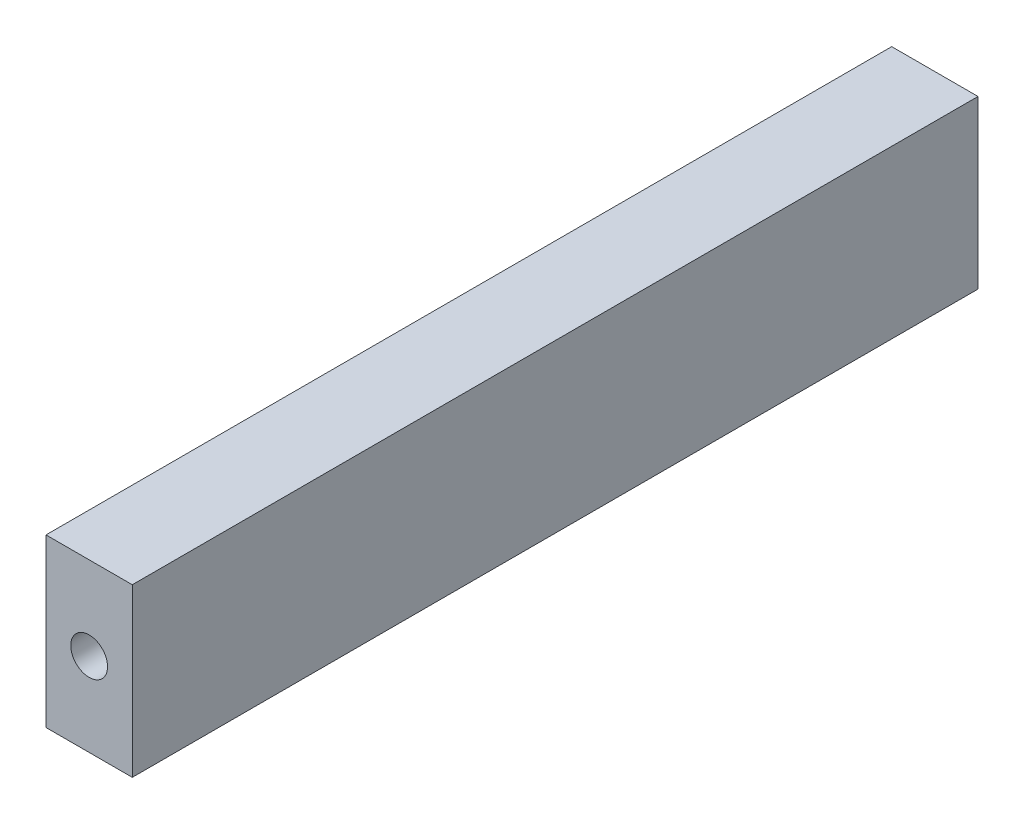
ISO-10303-21;
HEADER;
FILE_DESCRIPTION(('STEP AP214'),'2;1');
FILE_NAME('part.step','',(''),(''),'','','');
FILE_SCHEMA(('AUTOMOTIVE_DESIGN { 1 0 10303 214 1 1 1 1 }'));
ENDSEC;
DATA;
#1=APPLICATION_CONTEXT('core data for automotive mechanical design processes');
#2=APPLICATION_PROTOCOL_DEFINITION('international standard','automotive_design',2000,#1);
#3=PRODUCT_CONTEXT('',#1,'mechanical');
#4=PRODUCT('Part','Part','',(#3));
#5=PRODUCT_RELATED_PRODUCT_CATEGORY('part','',(#4));
#6=PRODUCT_DEFINITION_FORMATION('','',#4);
#7=PRODUCT_DEFINITION_CONTEXT('part definition',#1,'design');
#8=PRODUCT_DEFINITION('design','',#6,#7);
#9=PRODUCT_DEFINITION_SHAPE('','',#8);
#10=(LENGTH_UNIT() NAMED_UNIT(*) SI_UNIT(.MILLI.,.METRE.));
#11=(NAMED_UNIT(*) PLANE_ANGLE_UNIT() SI_UNIT($,.RADIAN.));
#12=(NAMED_UNIT(*) SI_UNIT($,.STERADIAN.) SOLID_ANGLE_UNIT());
#13=UNCERTAINTY_MEASURE_WITH_UNIT(LENGTH_MEASURE(1.E-05),#10,'distance_accuracy_value','');
#14=(GEOMETRIC_REPRESENTATION_CONTEXT(3) GLOBAL_UNCERTAINTY_ASSIGNED_CONTEXT((#13)) GLOBAL_UNIT_ASSIGNED_CONTEXT((#10,
#11,#12)) REPRESENTATION_CONTEXT('',''));
#15=CARTESIAN_POINT('',(0.,0.,0.));
#16=DIRECTION('',(0.,0.,1.));
#17=DIRECTION('',(1.,0.,0.));
#18=AXIS2_PLACEMENT_3D('',#15,#16,#17);
#19=CARTESIAN_POINT('',(-26.9849246231156,34.6733668341708,147.));
#20=DIRECTION('',(-1.,0.,0.));
#21=DIRECTION('',(0.,-1.,0.));
#22=AXIS2_PLACEMENT_3D('',#19,#20,#21);
#23=PLANE('',#22);
#24=DIRECTION('',(0.,1.,0.));
#25=VECTOR('',#24,1.);
#26=CARTESIAN_POINT('',(-26.9849246231156,34.6733668341708,0.));
#27=LINE('',#26,#25);
#28=CARTESIAN_POINT('',(-26.9849246231156,5.67336683417085,0.));
#29=VERTEX_POINT('',#28);
#30=CARTESIAN_POINT('',(-26.9849246231156,34.6733668341708,0.));
#31=VERTEX_POINT('',#30);
#32=EDGE_CURVE('E100',#29,#31,#27,.T.);
#33=ORIENTED_EDGE('',*,*,#32,.T.);
#34=DIRECTION('',(0.,0.,-1.));
#35=VECTOR('',#34,1.);
#36=CARTESIAN_POINT('',(-26.9849246231156,34.6733668341708,147.));
#37=LINE('',#36,#35);
#38=CARTESIAN_POINT('',(-26.9849246231156,34.6733668341708,147.));
#39=VERTEX_POINT('',#38);
#40=EDGE_CURVE('E11',#39,#31,#37,.T.);
#41=ORIENTED_EDGE('',*,*,#40,.F.);
#42=DIRECTION('',(0.,1.,0.));
#43=VECTOR('',#42,1.);
#44=CARTESIAN_POINT('',(-26.9849246231156,34.6733668341708,147.));
#45=LINE('',#44,#43);
#46=CARTESIAN_POINT('',(-26.9849246231156,5.67336683417085,147.));
#47=VERTEX_POINT('',#46);
#48=EDGE_CURVE('E88',#47,#39,#45,.T.);
#49=ORIENTED_EDGE('',*,*,#48,.F.);
#50=DIRECTION('',(0.,0.,-1.));
#51=VECTOR('',#50,1.);
#52=CARTESIAN_POINT('',(-26.9849246231156,5.67336683417085,147.));
#53=LINE('',#52,#51);
#54=EDGE_CURVE('E96',#47,#29,#53,.T.);
#55=ORIENTED_EDGE('',*,*,#54,.T.);
#56=EDGE_LOOP('',(#33,#41,#49,#55));
#57=FACE_BOUND('',#56,.T.);
#58=ADVANCED_FACE('F37',(#57),#23,.F.);
#59=CARTESIAN_POINT('',(-41.9849246231156,34.6733668341708,147.));
#60=DIRECTION('',(0.,-1.,0.));
#61=DIRECTION('',(0.,0.,-1.));
#62=AXIS2_PLACEMENT_3D('',#59,#60,#61);
#63=PLANE('',#62);
#64=DIRECTION('',(-1.,0.,0.));
#65=VECTOR('',#64,1.);
#66=CARTESIAN_POINT('',(-41.9849246231156,34.6733668341708,0.));
#67=LINE('',#66,#65);
#68=CARTESIAN_POINT('',(-41.9849246231156,34.6733668341708,0.));
#69=VERTEX_POINT('',#68);
#70=EDGE_CURVE('E92',#31,#69,#67,.T.);
#71=ORIENTED_EDGE('',*,*,#70,.T.);
#72=DIRECTION('',(0.,0.,-1.));
#73=VECTOR('',#72,1.);
#74=CARTESIAN_POINT('',(-41.9849246231156,34.6733668341708,147.));
#75=LINE('',#74,#73);
#76=CARTESIAN_POINT('',(-41.9849246231156,34.6733668341708,147.));
#77=VERTEX_POINT('',#76);
#78=EDGE_CURVE('E45',#77,#69,#75,.T.);
#79=ORIENTED_EDGE('',*,*,#78,.F.);
#80=DIRECTION('',(-1.,0.,0.));
#81=VECTOR('',#80,1.);
#82=CARTESIAN_POINT('',(-41.9849246231156,34.6733668341708,147.));
#83=LINE('',#82,#81);
#84=EDGE_CURVE('E83',#39,#77,#83,.T.);
#85=ORIENTED_EDGE('',*,*,#84,.F.);
#86=ORIENTED_EDGE('',*,*,#40,.T.);
#87=EDGE_LOOP('',(#71,#79,#85,#86));
#88=FACE_BOUND('',#87,.T.);
#89=ADVANCED_FACE('F91',(#88),#63,.F.);
#90=CARTESIAN_POINT('',(-41.9849246231156,34.6733668341708,147.));
#91=DIRECTION('',(1.,0.,0.));
#92=DIRECTION('',(0.,0.,-1.));
#93=AXIS2_PLACEMENT_3D('',#90,#91,#92);
#94=PLANE('',#93);
#95=DIRECTION('',(0.,-1.,0.));
#96=VECTOR('',#95,1.);
#97=CARTESIAN_POINT('',(-41.9849246231156,34.6733668341708,0.));
#98=LINE('',#97,#96);
#99=CARTESIAN_POINT('',(-41.9849246231156,5.67336683417085,0.));
#100=VERTEX_POINT('',#99);
#101=EDGE_CURVE('E70',#69,#100,#98,.T.);
#102=ORIENTED_EDGE('',*,*,#101,.T.);
#103=DIRECTION('',(0.,0.,-1.));
#104=VECTOR('',#103,1.);
#105=CARTESIAN_POINT('',(-41.9849246231156,5.67336683417085,147.));
#106=LINE('',#105,#104);
#107=CARTESIAN_POINT('',(-41.9849246231156,5.67336683417085,147.));
#108=VERTEX_POINT('',#107);
#109=EDGE_CURVE('E93',#108,#100,#106,.T.);
#110=ORIENTED_EDGE('',*,*,#109,.F.);
#111=DIRECTION('',(0.,-1.,0.));
#112=VECTOR('',#111,1.);
#113=CARTESIAN_POINT('',(-41.9849246231156,34.6733668341708,147.));
#114=LINE('',#113,#112);
#115=EDGE_CURVE('E86',#77,#108,#114,.T.);
#116=ORIENTED_EDGE('',*,*,#115,.F.);
#117=ORIENTED_EDGE('',*,*,#78,.T.);
#118=EDGE_LOOP('',(#102,#110,#116,#117));
#119=FACE_BOUND('',#118,.T.);
#120=ADVANCED_FACE('F94',(#119),#94,.F.);
#121=CARTESIAN_POINT('',(-41.9849246231156,5.67336683417085,147.));
#122=DIRECTION('',(0.,1.,0.));
#123=DIRECTION('',(0.,0.,1.));
#124=AXIS2_PLACEMENT_3D('',#121,#122,#123);
#125=PLANE('',#124);
#126=DIRECTION('',(1.,0.,0.));
#127=VECTOR('',#126,1.);
#128=CARTESIAN_POINT('',(-41.9849246231156,5.67336683417085,0.));
#129=LINE('',#128,#127);
#130=EDGE_CURVE('E76',#100,#29,#129,.T.);
#131=ORIENTED_EDGE('',*,*,#130,.T.);
#132=ORIENTED_EDGE('',*,*,#54,.F.);
#133=DIRECTION('',(1.,0.,0.));
#134=VECTOR('',#133,1.);
#135=CARTESIAN_POINT('',(-41.9849246231156,5.67336683417085,147.));
#136=LINE('',#135,#134);
#137=EDGE_CURVE('E53',#108,#47,#136,.T.);
#138=ORIENTED_EDGE('',*,*,#137,.F.);
#139=ORIENTED_EDGE('',*,*,#109,.T.);
#140=EDGE_LOOP('',(#131,#132,#138,#139));
#141=FACE_BOUND('',#140,.T.);
#142=ADVANCED_FACE('F108',(#141),#125,.F.);
#143=CARTESIAN_POINT('',(0.,0.,147.));
#144=DIRECTION('',(0.,0.,1.));
#145=DIRECTION('',(1.,0.,0.));
#146=AXIS2_PLACEMENT_3D('',#143,#144,#145);
#147=PLANE('',#146);
#148=CARTESIAN_POINT('',(-34.4849246231156,20.1733668341708,147.));
#149=DIRECTION('',(0.,0.,1.));
#150=DIRECTION('',(1.,0.,0.));
#151=AXIS2_PLACEMENT_3D('',#148,#149,#150);
#152=CIRCLE('',#151,3.2);
#153=CARTESIAN_POINT('',(-31.2849246231156,20.1733668341708,147.));
#154=VERTEX_POINT('',#153);
#155=EDGE_CURVE('E114',#154,#154,#152,.T.);
#156=ORIENTED_EDGE('',*,*,#155,.F.);
#157=EDGE_LOOP('',(#156));
#158=FACE_BOUND('',#157,.T.);
#159=ORIENTED_EDGE('',*,*,#48,.T.);
#160=ORIENTED_EDGE('',*,*,#84,.T.);
#161=ORIENTED_EDGE('',*,*,#115,.T.);
#162=ORIENTED_EDGE('',*,*,#137,.T.);
#163=EDGE_LOOP('',(#159,#160,#161,#162));
#164=FACE_BOUND('',#163,.T.);
#165=ADVANCED_FACE('F84',(#158,#164),#147,.T.);
#166=CARTESIAN_POINT('',(0.,0.,0.));
#167=DIRECTION('',(0.,0.,1.));
#168=DIRECTION('',(1.,0.,0.));
#169=AXIS2_PLACEMENT_3D('',#166,#167,#168);
#170=PLANE('',#169);
#171=CARTESIAN_POINT('',(-34.4849246231156,20.1733668341708,0.));
#172=DIRECTION('',(0.,0.,1.));
#173=DIRECTION('',(1.,0.,0.));
#174=AXIS2_PLACEMENT_3D('',#171,#172,#173);
#175=CIRCLE('',#174,3.2);
#176=CARTESIAN_POINT('',(-31.2849246231156,20.1733668341708,0.));
#177=VERTEX_POINT('',#176);
#178=EDGE_CURVE('E120',#177,#177,#175,.T.);
#179=ORIENTED_EDGE('',*,*,#178,.T.);
#180=EDGE_LOOP('',(#179));
#181=FACE_BOUND('',#180,.T.);
#182=ORIENTED_EDGE('',*,*,#32,.F.);
#183=ORIENTED_EDGE('',*,*,#130,.F.);
#184=ORIENTED_EDGE('',*,*,#101,.F.);
#185=ORIENTED_EDGE('',*,*,#70,.F.);
#186=EDGE_LOOP('',(#182,#183,#184,#185));
#187=FACE_BOUND('',#186,.T.);
#188=ADVANCED_FACE('F111',(#181,#187),#170,.F.);
#189=CARTESIAN_POINT('',(-34.4849246231156,20.1733668341708,137.5));
#190=DIRECTION('',(0.,0.,1.));
#191=DIRECTION('',(1.,0.,0.));
#192=AXIS2_PLACEMENT_3D('',#189,#190,#191);
#193=CYLINDRICAL_SURFACE('',#192,3.2);
#194=CARTESIAN_POINT('',(-34.4849246231156,20.1733668341708,137.5));
#195=DIRECTION('',(0.,0.,1.));
#196=DIRECTION('',(1.,0.,0.));
#197=AXIS2_PLACEMENT_3D('',#194,#195,#196);
#198=CIRCLE('',#197,3.2);
#199=CARTESIAN_POINT('',(-31.2849246231156,20.1733668341708,137.5));
#200=VERTEX_POINT('',#199);
#201=EDGE_CURVE('E103',#200,#200,#198,.T.);
#202=ORIENTED_EDGE('',*,*,#201,.F.);
#203=EDGE_LOOP('',(#202));
#204=FACE_BOUND('',#203,.T.);
#205=ORIENTED_EDGE('',*,*,#155,.T.);
#206=EDGE_LOOP('',(#205));
#207=FACE_BOUND('',#206,.T.);
#208=ADVANCED_FACE('F150',(#204,#207),#193,.F.);
#209=CARTESIAN_POINT('',(-34.4849246231156,20.1733668341708,137.5));
#210=DIRECTION('',(0.,0.,1.));
#211=DIRECTION('',(1.,0.,0.));
#212=AXIS2_PLACEMENT_3D('',#209,#210,#211);
#213=PLANE('',#212);
#214=ORIENTED_EDGE('',*,*,#201,.T.);
#215=EDGE_LOOP('',(#214));
#216=FACE_BOUND('',#215,.T.);
#217=ADVANCED_FACE('F135',(#216),#213,.T.);
#218=CARTESIAN_POINT('',(-34.4849246231156,20.1733668341708,9.5));
#219=DIRECTION('',(0.,0.,-1.));
#220=DIRECTION('',(-1.,0.,0.));
#221=AXIS2_PLACEMENT_3D('',#218,#219,#220);
#222=CYLINDRICAL_SURFACE('',#221,3.2);
#223=CARTESIAN_POINT('',(-34.4849246231156,20.1733668341708,9.5));
#224=DIRECTION('',(0.,0.,1.));
#225=DIRECTION('',(1.,0.,0.));
#226=AXIS2_PLACEMENT_3D('',#223,#224,#225);
#227=CIRCLE('',#226,3.2);
#228=CARTESIAN_POINT('',(-31.2849246231156,20.1733668341708,9.5));
#229=VERTEX_POINT('',#228);
#230=EDGE_CURVE('E117',#229,#229,#227,.T.);
#231=ORIENTED_EDGE('',*,*,#230,.T.);
#232=EDGE_LOOP('',(#231));
#233=FACE_BOUND('',#232,.T.);
#234=ORIENTED_EDGE('',*,*,#178,.F.);
#235=EDGE_LOOP('',(#234));
#236=FACE_BOUND('',#235,.T.);
#237=ADVANCED_FACE('F126',(#233,#236),#222,.F.);
#238=CARTESIAN_POINT('',(-34.4849246231156,20.1733668341708,9.5));
#239=DIRECTION('',(0.,0.,-1.));
#240=DIRECTION('',(1.,0.,0.));
#241=AXIS2_PLACEMENT_3D('',#238,#239,#240);
#242=PLANE('',#241);
#243=ORIENTED_EDGE('',*,*,#230,.F.);
#244=EDGE_LOOP('',(#243));
#245=FACE_BOUND('',#244,.T.);
#246=ADVANCED_FACE('F129',(#245),#242,.T.);
#247=CLOSED_SHELL('',(#58,#89,#120,#142,#165,#188,#208,#217,#237,#246));
#248=MANIFOLD_SOLID_BREP('B2',#247);
#249=ADVANCED_BREP_SHAPE_REPRESENTATION('',(#18,#248),#14);
#250=SHAPE_DEFINITION_REPRESENTATION(#9,#249);
ENDSEC;
END-ISO-10303-21;
